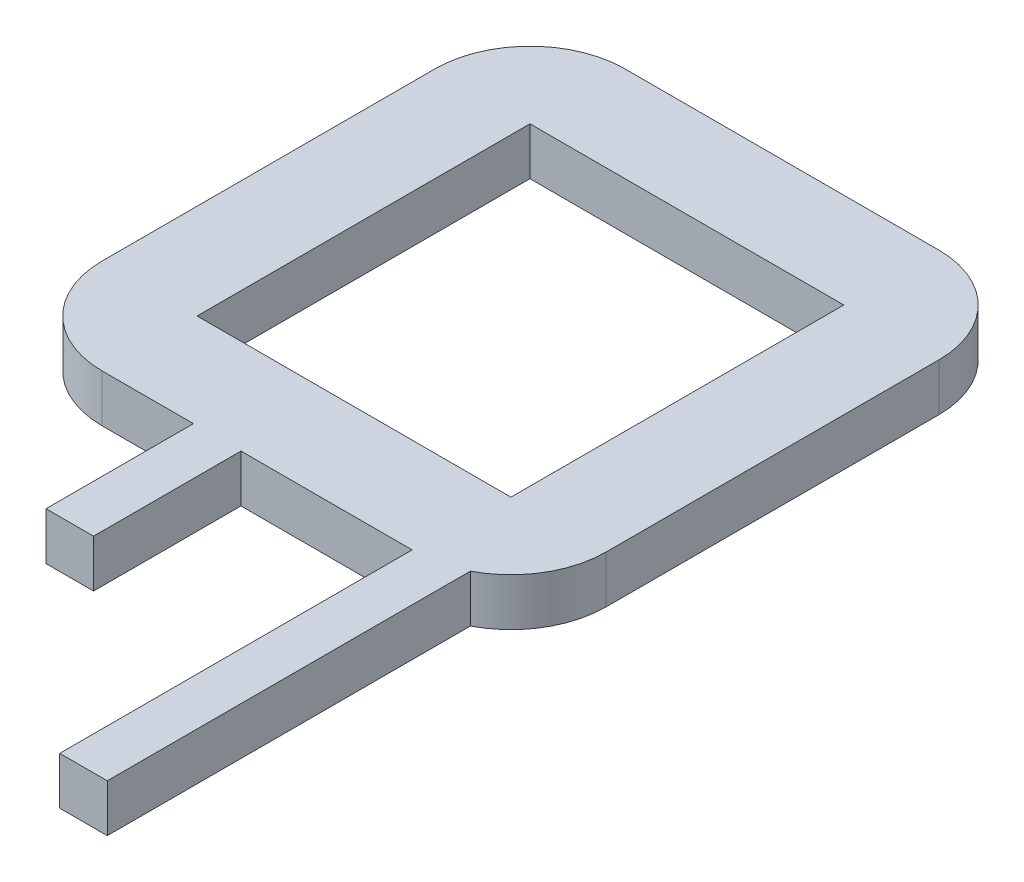
ISO-10303-21;
HEADER;
FILE_DESCRIPTION(('STEP AP214'),'2;1');
FILE_NAME('part.step','',(''),(''),'','','');
FILE_SCHEMA(('AUTOMOTIVE_DESIGN { 1 0 10303 214 1 1 1 1 }'));
ENDSEC;
DATA;
#1=APPLICATION_CONTEXT('core data for automotive mechanical design processes');
#2=APPLICATION_PROTOCOL_DEFINITION('international standard','automotive_design',2000,#1);
#3=PRODUCT_CONTEXT('',#1,'mechanical');
#4=PRODUCT('Part','Part','',(#3));
#5=PRODUCT_RELATED_PRODUCT_CATEGORY('part','',(#4));
#6=PRODUCT_DEFINITION_FORMATION('','',#4);
#7=PRODUCT_DEFINITION_CONTEXT('part definition',#1,'design');
#8=PRODUCT_DEFINITION('design','',#6,#7);
#9=PRODUCT_DEFINITION_SHAPE('','',#8);
#10=(LENGTH_UNIT() NAMED_UNIT(*) SI_UNIT(.MILLI.,.METRE.));
#11=(NAMED_UNIT(*) PLANE_ANGLE_UNIT() SI_UNIT($,.RADIAN.));
#12=(NAMED_UNIT(*) SI_UNIT($,.STERADIAN.) SOLID_ANGLE_UNIT());
#13=UNCERTAINTY_MEASURE_WITH_UNIT(LENGTH_MEASURE(1.E-05),#10,'distance_accuracy_value','');
#14=(GEOMETRIC_REPRESENTATION_CONTEXT(3) GLOBAL_UNCERTAINTY_ASSIGNED_CONTEXT((#13)) GLOBAL_UNIT_ASSIGNED_CONTEXT((#10,
#11,#12)) REPRESENTATION_CONTEXT('',''));
#15=CARTESIAN_POINT('',(0.,0.,0.));
#16=DIRECTION('',(0.,0.,1.));
#17=DIRECTION('',(1.,0.,0.));
#18=AXIS2_PLACEMENT_3D('',#15,#16,#17);
#19=CARTESIAN_POINT('',(0.,5.,17.5));
#20=DIRECTION('',(0.,0.,1.));
#21=DIRECTION('',(1.,0.,0.));
#22=AXIS2_PLACEMENT_3D('',#19,#20,#21);
#23=PLANE('',#22);
#24=DIRECTION('',(-1.,0.,0.));
#25=VECTOR('',#24,1.);
#26=CARTESIAN_POINT('',(0.,0.,17.5));
#27=LINE('',#26,#25);
#28=CARTESIAN_POINT('',(16.5,0.,17.5));
#29=VERTEX_POINT('',#28);
#30=CARTESIAN_POINT('',(-16.5,0.,17.5));
#31=VERTEX_POINT('',#30);
#32=EDGE_CURVE('E238',#29,#31,#27,.T.);
#33=ORIENTED_EDGE('',*,*,#32,.T.);
#34=DIRECTION('',(0.,-1.,0.));
#35=VECTOR('',#34,1.);
#36=CARTESIAN_POINT('',(-16.5,5.,17.5));
#37=LINE('',#36,#35);
#38=CARTESIAN_POINT('',(-16.5,5.,17.5));
#39=VERTEX_POINT('',#38);
#40=EDGE_CURVE('E11',#39,#31,#37,.T.);
#41=ORIENTED_EDGE('',*,*,#40,.F.);
#42=DIRECTION('',(-1.,0.,0.));
#43=VECTOR('',#42,1.);
#44=CARTESIAN_POINT('',(0.,5.,17.5));
#45=LINE('',#44,#43);
#46=CARTESIAN_POINT('',(16.5,5.,17.5));
#47=VERTEX_POINT('',#46);
#48=EDGE_CURVE('E180',#47,#39,#45,.T.);
#49=ORIENTED_EDGE('',*,*,#48,.F.);
#50=DIRECTION('',(0.,-1.,0.));
#51=VECTOR('',#50,1.);
#52=CARTESIAN_POINT('',(16.5,5.,17.5));
#53=LINE('',#52,#51);
#54=EDGE_CURVE('E54',#47,#29,#53,.T.);
#55=ORIENTED_EDGE('',*,*,#54,.T.);
#56=EDGE_LOOP('',(#33,#41,#49,#55));
#57=FACE_BOUND('',#56,.T.);
#58=ADVANCED_FACE('F35',(#57),#23,.F.);
#59=CARTESIAN_POINT('',(-16.5,5.,0.));
#60=DIRECTION('',(-1.,0.,0.));
#61=DIRECTION('',(0.,0.,1.));
#62=AXIS2_PLACEMENT_3D('',#59,#60,#61);
#63=PLANE('',#62);
#64=DIRECTION('',(0.,0.,-1.));
#65=VECTOR('',#64,1.);
#66=CARTESIAN_POINT('',(-16.5,0.,0.));
#67=LINE('',#66,#65);
#68=CARTESIAN_POINT('',(-16.5,0.,-17.5));
#69=VERTEX_POINT('',#68);
#70=EDGE_CURVE('E186',#31,#69,#67,.T.);
#71=ORIENTED_EDGE('',*,*,#70,.T.);
#72=DIRECTION('',(0.,-1.,0.));
#73=VECTOR('',#72,1.);
#74=CARTESIAN_POINT('',(-16.5,5.,-17.5));
#75=LINE('',#74,#73);
#76=CARTESIAN_POINT('',(-16.5,5.,-17.5));
#77=VERTEX_POINT('',#76);
#78=EDGE_CURVE('E45',#77,#69,#75,.T.);
#79=ORIENTED_EDGE('',*,*,#78,.F.);
#80=DIRECTION('',(0.,0.,-1.));
#81=VECTOR('',#80,1.);
#82=CARTESIAN_POINT('',(-16.5,5.,0.));
#83=LINE('',#82,#81);
#84=EDGE_CURVE('E174',#39,#77,#83,.T.);
#85=ORIENTED_EDGE('',*,*,#84,.F.);
#86=ORIENTED_EDGE('',*,*,#40,.T.);
#87=EDGE_LOOP('',(#71,#79,#85,#86));
#88=FACE_BOUND('',#87,.T.);
#89=ADVANCED_FACE('F185',(#88),#63,.F.);
#90=CARTESIAN_POINT('',(0.,5.,-17.5));
#91=DIRECTION('',(0.,0.,1.));
#92=DIRECTION('',(1.,0.,0.));
#93=AXIS2_PLACEMENT_3D('',#90,#91,#92);
#94=PLANE('',#93);
#95=DIRECTION('',(-1.,0.,0.));
#96=VECTOR('',#95,1.);
#97=CARTESIAN_POINT('',(0.,0.,-17.5));
#98=LINE('',#97,#96);
#99=CARTESIAN_POINT('',(16.5,0.,-17.5));
#100=VERTEX_POINT('',#99);
#101=EDGE_CURVE('E241',#100,#69,#98,.T.);
#102=ORIENTED_EDGE('',*,*,#101,.F.);
#103=DIRECTION('',(0.,-1.,0.));
#104=VECTOR('',#103,1.);
#105=CARTESIAN_POINT('',(16.5,5.,-17.5));
#106=LINE('',#105,#104);
#107=CARTESIAN_POINT('',(16.5,5.,-17.5));
#108=VERTEX_POINT('',#107);
#109=EDGE_CURVE('E113',#108,#100,#106,.T.);
#110=ORIENTED_EDGE('',*,*,#109,.F.);
#111=DIRECTION('',(-1.,0.,0.));
#112=VECTOR('',#111,1.);
#113=CARTESIAN_POINT('',(0.,5.,-17.5));
#114=LINE('',#113,#112);
#115=EDGE_CURVE('E179',#108,#77,#114,.T.);
#116=ORIENTED_EDGE('',*,*,#115,.T.);
#117=ORIENTED_EDGE('',*,*,#78,.T.);
#118=EDGE_LOOP('',(#102,#110,#116,#117));
#119=FACE_BOUND('',#118,.T.);
#120=ADVANCED_FACE('F190',(#119),#94,.T.);
#121=CARTESIAN_POINT('',(0.,5.,27.5));
#122=DIRECTION('',(0.,0.,1.));
#123=DIRECTION('',(1.,0.,0.));
#124=AXIS2_PLACEMENT_3D('',#121,#122,#123);
#125=PLANE('',#124);
#126=DIRECTION('',(-1.,0.,0.));
#127=VECTOR('',#126,1.);
#128=CARTESIAN_POINT('',(0.,0.,27.5));
#129=LINE('',#128,#127);
#130=CARTESIAN_POINT('',(16.1075449657305,0.,27.5));
#131=VERTEX_POINT('',#130);
#132=CARTESIAN_POINT('',(-1.89245503426954,0.,27.5));
#133=VERTEX_POINT('',#132);
#134=EDGE_CURVE('E197',#131,#133,#129,.T.);
#135=ORIENTED_EDGE('',*,*,#134,.F.);
#136=DIRECTION('',(0.,-1.,0.));
#137=VECTOR('',#136,1.);
#138=CARTESIAN_POINT('',(16.1075449657305,5.,27.5));
#139=LINE('',#138,#137);
#140=CARTESIAN_POINT('',(16.1075449657305,5.,27.5));
#141=VERTEX_POINT('',#140);
#142=EDGE_CURVE('E39',#141,#131,#139,.T.);
#143=ORIENTED_EDGE('',*,*,#142,.F.);
#144=DIRECTION('',(-1.,0.,0.));
#145=VECTOR('',#144,1.);
#146=CARTESIAN_POINT('',(0.,5.,27.5));
#147=LINE('',#146,#145);
#148=CARTESIAN_POINT('',(-1.89245503426954,5.,27.5));
#149=VERTEX_POINT('',#148);
#150=EDGE_CURVE('E246',#141,#149,#147,.T.);
#151=ORIENTED_EDGE('',*,*,#150,.T.);
#152=DIRECTION('',(0.,-1.,0.));
#153=VECTOR('',#152,1.);
#154=CARTESIAN_POINT('',(-1.89245503426954,5.,27.5));
#155=LINE('',#154,#153);
#156=EDGE_CURVE('E193',#149,#133,#155,.T.);
#157=ORIENTED_EDGE('',*,*,#156,.T.);
#158=EDGE_LOOP('',(#135,#143,#151,#157));
#159=FACE_BOUND('',#158,.T.);
#160=ADVANCED_FACE('F289',(#159),#125,.T.);
#161=CARTESIAN_POINT('',(16.1075449657305,5.,0.));
#162=DIRECTION('',(1.,0.,0.));
#163=DIRECTION('',(0.,0.,-1.));
#164=AXIS2_PLACEMENT_3D('',#161,#162,#163);
#165=PLANE('',#164);
#166=DIRECTION('',(0.,0.,1.));
#167=VECTOR('',#166,1.);
#168=CARTESIAN_POINT('',(16.1075449657305,0.,0.));
#169=LINE('',#168,#167);
#170=CARTESIAN_POINT('',(16.1075449657305,0.,64.5549858242216));
#171=VERTEX_POINT('',#170);
#172=EDGE_CURVE('E200',#131,#171,#169,.T.);
#173=ORIENTED_EDGE('',*,*,#172,.T.);
#174=DIRECTION('',(0.,-1.,0.));
#175=VECTOR('',#174,1.);
#176=CARTESIAN_POINT('',(16.1075449657305,5.,64.5549858242216));
#177=LINE('',#176,#175);
#178=CARTESIAN_POINT('',(16.1075449657305,5.,64.5549858242216));
#179=VERTEX_POINT('',#178);
#180=EDGE_CURVE('E275',#179,#171,#177,.T.);
#181=ORIENTED_EDGE('',*,*,#180,.F.);
#182=DIRECTION('',(0.,0.,1.));
#183=VECTOR('',#182,1.);
#184=CARTESIAN_POINT('',(16.1075449657305,5.,0.));
#185=LINE('',#184,#183);
#186=EDGE_CURVE('E282',#141,#179,#185,.T.);
#187=ORIENTED_EDGE('',*,*,#186,.F.);
#188=ORIENTED_EDGE('',*,*,#142,.T.);
#189=EDGE_LOOP('',(#173,#181,#187,#188));
#190=FACE_BOUND('',#189,.T.);
#191=ADVANCED_FACE('F37',(#190),#165,.F.);
#192=CARTESIAN_POINT('',(0.,5.,64.5549858242216));
#193=DIRECTION('',(0.,0.,1.));
#194=DIRECTION('',(1.,0.,0.));
#195=AXIS2_PLACEMENT_3D('',#192,#193,#194);
#196=PLANE('',#195);
#197=DIRECTION('',(-1.,0.,0.));
#198=VECTOR('',#197,1.);
#199=CARTESIAN_POINT('',(0.,0.,64.5549858242216));
#200=LINE('',#199,#198);
#201=CARTESIAN_POINT('',(21.1075449657305,0.,64.5549858242216));
#202=VERTEX_POINT('',#201);
#203=EDGE_CURVE('E204',#202,#171,#200,.T.);
#204=ORIENTED_EDGE('',*,*,#203,.F.);
#205=DIRECTION('',(0.,-1.,0.));
#206=VECTOR('',#205,1.);
#207=CARTESIAN_POINT('',(21.1075449657305,5.,64.5549858242216));
#208=LINE('',#207,#206);
#209=CARTESIAN_POINT('',(21.1075449657305,5.,64.5549858242216));
#210=VERTEX_POINT('',#209);
#211=EDGE_CURVE('E274',#210,#202,#208,.T.);
#212=ORIENTED_EDGE('',*,*,#211,.F.);
#213=DIRECTION('',(-1.,0.,0.));
#214=VECTOR('',#213,1.);
#215=CARTESIAN_POINT('',(0.,5.,64.5549858242216));
#216=LINE('',#215,#214);
#217=EDGE_CURVE('E357',#210,#179,#216,.T.);
#218=ORIENTED_EDGE('',*,*,#217,.T.);
#219=ORIENTED_EDGE('',*,*,#180,.T.);
#220=EDGE_LOOP('',(#204,#212,#218,#219));
#221=FACE_BOUND('',#220,.T.);
#222=ADVANCED_FACE('F356',(#221),#196,.T.);
#223=CARTESIAN_POINT('',(21.1075449657305,5.,0.));
#224=DIRECTION('',(-1.,0.,0.));
#225=DIRECTION('',(0.,0.,1.));
#226=AXIS2_PLACEMENT_3D('',#223,#224,#225);
#227=PLANE('',#226);
#228=DIRECTION('',(0.,0.,-1.));
#229=VECTOR('',#228,1.);
#230=CARTESIAN_POINT('',(21.1075449657305,0.,0.));
#231=LINE('',#230,#229);
#232=CARTESIAN_POINT('',(21.1075449657305,0.,26.3752762992919));
#233=VERTEX_POINT('',#232);
#234=EDGE_CURVE('E207',#202,#233,#231,.T.);
#235=ORIENTED_EDGE('',*,*,#234,.T.);
#236=DIRECTION('',(0.,-1.,0.));
#237=VECTOR('',#236,1.);
#238=CARTESIAN_POINT('',(21.1075449657305,5.,26.3752762992919));
#239=LINE('',#238,#237);
#240=CARTESIAN_POINT('',(21.1075449657305,5.,26.3752762992919));
#241=VERTEX_POINT('',#240);
#242=EDGE_CURVE('E271',#241,#233,#239,.T.);
#243=ORIENTED_EDGE('',*,*,#242,.F.);
#244=DIRECTION('',(0.,0.,-1.));
#245=VECTOR('',#244,1.);
#246=CARTESIAN_POINT('',(21.1075449657305,5.,0.));
#247=LINE('',#246,#245);
#248=EDGE_CURVE('E354',#210,#241,#247,.T.);
#249=ORIENTED_EDGE('',*,*,#248,.F.);
#250=ORIENTED_EDGE('',*,*,#211,.T.);
#251=EDGE_LOOP('',(#235,#243,#249,#250));
#252=FACE_BOUND('',#251,.T.);
#253=ADVANCED_FACE('F353',(#252),#227,.F.);
#254=CARTESIAN_POINT('',(16.5,5.,17.5));
#255=DIRECTION('',(0.,-1.,0.));
#256=DIRECTION('',(0.,0.,-1.));
#257=AXIS2_PLACEMENT_3D('',#254,#255,#256);
#258=CYLINDRICAL_SURFACE('',#257,10.);
#259=CARTESIAN_POINT('',(16.5,0.,17.5));
#260=DIRECTION('',(0.,1.,0.));
#261=DIRECTION('',(0.,0.,1.));
#262=AXIS2_PLACEMENT_3D('',#259,#260,#261);
#263=CIRCLE('',#262,10.);
#264=CARTESIAN_POINT('',(26.5,0.,17.5));
#265=VERTEX_POINT('',#264);
#266=EDGE_CURVE('E209',#233,#265,#263,.T.);
#267=ORIENTED_EDGE('',*,*,#266,.T.);
#268=DIRECTION('',(0.,-1.,0.));
#269=VECTOR('',#268,1.);
#270=CARTESIAN_POINT('',(26.5,5.,17.5));
#271=LINE('',#270,#269);
#272=CARTESIAN_POINT('',(26.5,5.,17.5));
#273=VERTEX_POINT('',#272);
#274=EDGE_CURVE('E268',#273,#265,#271,.T.);
#275=ORIENTED_EDGE('',*,*,#274,.F.);
#276=CARTESIAN_POINT('',(16.5,5.,17.5));
#277=DIRECTION('',(0.,1.,0.));
#278=DIRECTION('',(0.,0.,1.));
#279=AXIS2_PLACEMENT_3D('',#276,#277,#278);
#280=CIRCLE('',#279,10.);
#281=EDGE_CURVE('E350',#241,#273,#280,.T.);
#282=ORIENTED_EDGE('',*,*,#281,.F.);
#283=ORIENTED_EDGE('',*,*,#242,.T.);
#284=EDGE_LOOP('',(#267,#275,#282,#283));
#285=FACE_BOUND('',#284,.T.);
#286=ADVANCED_FACE('F347',(#285),#258,.T.);
#287=CARTESIAN_POINT('',(26.5,5.,0.));
#288=DIRECTION('',(-1.,0.,0.));
#289=DIRECTION('',(0.,0.,1.));
#290=AXIS2_PLACEMENT_3D('',#287,#288,#289);
#291=PLANE('',#290);
#292=DIRECTION('',(0.,0.,-1.));
#293=VECTOR('',#292,1.);
#294=CARTESIAN_POINT('',(26.5,0.,0.));
#295=LINE('',#294,#293);
#296=CARTESIAN_POINT('',(26.5,0.,-17.5));
#297=VERTEX_POINT('',#296);
#298=EDGE_CURVE('E211',#265,#297,#295,.T.);
#299=ORIENTED_EDGE('',*,*,#298,.T.);
#300=DIRECTION('',(0.,-1.,0.));
#301=VECTOR('',#300,1.);
#302=CARTESIAN_POINT('',(26.5,5.,-17.5));
#303=LINE('',#302,#301);
#304=CARTESIAN_POINT('',(26.5,5.,-17.5));
#305=VERTEX_POINT('',#304);
#306=EDGE_CURVE('E266',#305,#297,#303,.T.);
#307=ORIENTED_EDGE('',*,*,#306,.F.);
#308=DIRECTION('',(0.,0.,-1.));
#309=VECTOR('',#308,1.);
#310=CARTESIAN_POINT('',(26.5,5.,0.));
#311=LINE('',#310,#309);
#312=EDGE_CURVE('E365',#273,#305,#311,.T.);
#313=ORIENTED_EDGE('',*,*,#312,.F.);
#314=ORIENTED_EDGE('',*,*,#274,.T.);
#315=EDGE_LOOP('',(#299,#307,#313,#314));
#316=FACE_BOUND('',#315,.T.);
#317=ADVANCED_FACE('F343',(#316),#291,.F.);
#318=CARTESIAN_POINT('',(16.5,5.,-17.5));
#319=DIRECTION('',(0.,-1.,0.));
#320=DIRECTION('',(0.,0.,-1.));
#321=AXIS2_PLACEMENT_3D('',#318,#319,#320);
#322=CYLINDRICAL_SURFACE('',#321,9.99999999999999);
#323=CARTESIAN_POINT('',(16.5,0.,-17.5));
#324=DIRECTION('',(0.,1.,0.));
#325=DIRECTION('',(0.,0.,1.));
#326=AXIS2_PLACEMENT_3D('',#323,#324,#325);
#327=CIRCLE('',#326,9.99999999999999);
#328=CARTESIAN_POINT('',(16.5,0.,-27.5));
#329=VERTEX_POINT('',#328);
#330=EDGE_CURVE('E214',#329,#297,#327,.F.);
#331=ORIENTED_EDGE('',*,*,#330,.F.);
#332=DIRECTION('',(0.,-1.,0.));
#333=VECTOR('',#332,1.);
#334=CARTESIAN_POINT('',(16.5,5.,-27.5));
#335=LINE('',#334,#333);
#336=CARTESIAN_POINT('',(16.5,5.,-27.5));
#337=VERTEX_POINT('',#336);
#338=EDGE_CURVE('E264',#337,#329,#335,.T.);
#339=ORIENTED_EDGE('',*,*,#338,.F.);
#340=CARTESIAN_POINT('',(16.5,5.,-17.5));
#341=DIRECTION('',(0.,1.,0.));
#342=DIRECTION('',(0.,0.,1.));
#343=AXIS2_PLACEMENT_3D('',#340,#341,#342);
#344=CIRCLE('',#343,9.99999999999999);
#345=EDGE_CURVE('E340',#337,#305,#344,.F.);
#346=ORIENTED_EDGE('',*,*,#345,.T.);
#347=ORIENTED_EDGE('',*,*,#306,.T.);
#348=EDGE_LOOP('',(#331,#339,#346,#347));
#349=FACE_BOUND('',#348,.T.);
#350=ADVANCED_FACE('F335',(#349),#322,.T.);
#351=CARTESIAN_POINT('',(0.,5.,-27.5));
#352=DIRECTION('',(0.,0.,1.));
#353=DIRECTION('',(1.,0.,0.));
#354=AXIS2_PLACEMENT_3D('',#351,#352,#353);
#355=PLANE('',#354);
#356=DIRECTION('',(-1.,0.,0.));
#357=VECTOR('',#356,1.);
#358=CARTESIAN_POINT('',(0.,0.,-27.5));
#359=LINE('',#358,#357);
#360=CARTESIAN_POINT('',(-16.5,0.,-27.5));
#361=VERTEX_POINT('',#360);
#362=EDGE_CURVE('E217',#329,#361,#359,.T.);
#363=ORIENTED_EDGE('',*,*,#362,.T.);
#364=DIRECTION('',(0.,-1.,0.));
#365=VECTOR('',#364,1.);
#366=CARTESIAN_POINT('',(-16.5,5.,-27.5));
#367=LINE('',#366,#365);
#368=CARTESIAN_POINT('',(-16.5,5.,-27.5));
#369=VERTEX_POINT('',#368);
#370=EDGE_CURVE('E262',#369,#361,#367,.T.);
#371=ORIENTED_EDGE('',*,*,#370,.F.);
#372=DIRECTION('',(-1.,0.,0.));
#373=VECTOR('',#372,1.);
#374=CARTESIAN_POINT('',(0.,5.,-27.5));
#375=LINE('',#374,#373);
#376=EDGE_CURVE('E368',#337,#369,#375,.T.);
#377=ORIENTED_EDGE('',*,*,#376,.F.);
#378=ORIENTED_EDGE('',*,*,#338,.T.);
#379=EDGE_LOOP('',(#363,#371,#377,#378));
#380=FACE_BOUND('',#379,.T.);
#381=ADVANCED_FACE('F478',(#380),#355,.F.);
#382=CARTESIAN_POINT('',(-16.5,5.,-17.5));
#383=DIRECTION('',(0.,-1.,0.));
#384=DIRECTION('',(0.,0.,-1.));
#385=AXIS2_PLACEMENT_3D('',#382,#383,#384);
#386=CYLINDRICAL_SURFACE('',#385,9.99999999999997);
#387=CARTESIAN_POINT('',(-16.5,0.,-17.5));
#388=DIRECTION('',(0.,1.,0.));
#389=DIRECTION('',(0.,0.,1.));
#390=AXIS2_PLACEMENT_3D('',#387,#388,#389);
#391=CIRCLE('',#390,9.99999999999997);
#392=CARTESIAN_POINT('',(-26.5,0.,-17.5));
#393=VERTEX_POINT('',#392);
#394=EDGE_CURVE('E220',#393,#361,#391,.F.);
#395=ORIENTED_EDGE('',*,*,#394,.F.);
#396=DIRECTION('',(0.,-1.,0.));
#397=VECTOR('',#396,1.);
#398=CARTESIAN_POINT('',(-26.5,5.,-17.5));
#399=LINE('',#398,#397);
#400=CARTESIAN_POINT('',(-26.5,5.,-17.5));
#401=VERTEX_POINT('',#400);
#402=EDGE_CURVE('E260',#401,#393,#399,.T.);
#403=ORIENTED_EDGE('',*,*,#402,.F.);
#404=CARTESIAN_POINT('',(-16.5,5.,-17.5));
#405=DIRECTION('',(0.,1.,0.));
#406=DIRECTION('',(0.,0.,1.));
#407=AXIS2_PLACEMENT_3D('',#404,#405,#406);
#408=CIRCLE('',#407,9.99999999999997);
#409=EDGE_CURVE('E370',#401,#369,#408,.F.);
#410=ORIENTED_EDGE('',*,*,#409,.T.);
#411=ORIENTED_EDGE('',*,*,#370,.T.);
#412=EDGE_LOOP('',(#395,#403,#410,#411));
#413=FACE_BOUND('',#412,.T.);
#414=ADVANCED_FACE('F328',(#413),#386,.T.);
#415=CARTESIAN_POINT('',(-26.5,5.,0.));
#416=DIRECTION('',(-1.,0.,0.));
#417=DIRECTION('',(0.,0.,1.));
#418=AXIS2_PLACEMENT_3D('',#415,#416,#417);
#419=PLANE('',#418);
#420=DIRECTION('',(0.,0.,-1.));
#421=VECTOR('',#420,1.);
#422=CARTESIAN_POINT('',(-26.5,0.,0.));
#423=LINE('',#422,#421);
#424=CARTESIAN_POINT('',(-26.5,0.,17.5));
#425=VERTEX_POINT('',#424);
#426=EDGE_CURVE('E223',#425,#393,#423,.T.);
#427=ORIENTED_EDGE('',*,*,#426,.F.);
#428=DIRECTION('',(0.,-1.,0.));
#429=VECTOR('',#428,1.);
#430=CARTESIAN_POINT('',(-26.5,5.,17.5));
#431=LINE('',#430,#429);
#432=CARTESIAN_POINT('',(-26.5,5.,17.5));
#433=VERTEX_POINT('',#432);
#434=EDGE_CURVE('E258',#433,#425,#431,.T.);
#435=ORIENTED_EDGE('',*,*,#434,.F.);
#436=DIRECTION('',(0.,0.,-1.));
#437=VECTOR('',#436,1.);
#438=CARTESIAN_POINT('',(-26.5,5.,0.));
#439=LINE('',#438,#437);
#440=EDGE_CURVE('E324',#433,#401,#439,.T.);
#441=ORIENTED_EDGE('',*,*,#440,.T.);
#442=ORIENTED_EDGE('',*,*,#402,.T.);
#443=EDGE_LOOP('',(#427,#435,#441,#442));
#444=FACE_BOUND('',#443,.T.);
#445=ADVANCED_FACE('F319',(#444),#419,.T.);
#446=CARTESIAN_POINT('',(-16.5,5.,17.5));
#447=DIRECTION('',(0.,-1.,0.));
#448=DIRECTION('',(0.,0.,-1.));
#449=AXIS2_PLACEMENT_3D('',#446,#447,#448);
#450=CYLINDRICAL_SURFACE('',#449,9.99999999999999);
#451=CARTESIAN_POINT('',(-16.5,0.,17.5));
#452=DIRECTION('',(0.,1.,0.));
#453=DIRECTION('',(0.,0.,1.));
#454=AXIS2_PLACEMENT_3D('',#451,#452,#453);
#455=CIRCLE('',#454,9.99999999999999);
#456=CARTESIAN_POINT('',(-16.5,0.,27.5));
#457=VERTEX_POINT('',#456);
#458=EDGE_CURVE('E226',#425,#457,#455,.T.);
#459=ORIENTED_EDGE('',*,*,#458,.T.);
#460=DIRECTION('',(0.,-1.,0.));
#461=VECTOR('',#460,1.);
#462=CARTESIAN_POINT('',(-16.5,5.,27.5));
#463=LINE('',#462,#461);
#464=CARTESIAN_POINT('',(-16.5,5.,27.5));
#465=VERTEX_POINT('',#464);
#466=EDGE_CURVE('E256',#465,#457,#463,.T.);
#467=ORIENTED_EDGE('',*,*,#466,.F.);
#468=CARTESIAN_POINT('',(-16.5,5.,17.5));
#469=DIRECTION('',(0.,1.,0.));
#470=DIRECTION('',(0.,0.,1.));
#471=AXIS2_PLACEMENT_3D('',#468,#469,#470);
#472=CIRCLE('',#471,9.99999999999999);
#473=EDGE_CURVE('E373',#433,#465,#472,.T.);
#474=ORIENTED_EDGE('',*,*,#473,.F.);
#475=ORIENTED_EDGE('',*,*,#434,.T.);
#476=EDGE_LOOP('',(#459,#467,#474,#475));
#477=FACE_BOUND('',#476,.T.);
#478=ADVANCED_FACE('F377',(#477),#450,.T.);
#479=CARTESIAN_POINT('',(-6.89245503426954,0.,27.5));
#480=VERTEX_POINT('',#479);
#481=EDGE_CURVE('E201',#480,#457,#129,.T.);
#482=ORIENTED_EDGE('',*,*,#481,.F.);
#483=DIRECTION('',(0.,-1.,0.));
#484=VECTOR('',#483,1.);
#485=CARTESIAN_POINT('',(-6.89245503426954,5.,27.5));
#486=LINE('',#485,#484);
#487=CARTESIAN_POINT('',(-6.89245503426954,5.,27.5));
#488=VERTEX_POINT('',#487);
#489=EDGE_CURVE('E254',#488,#480,#486,.T.);
#490=ORIENTED_EDGE('',*,*,#489,.F.);
#491=EDGE_CURVE('E313',#488,#465,#147,.T.);
#492=ORIENTED_EDGE('',*,*,#491,.T.);
#493=ORIENTED_EDGE('',*,*,#466,.T.);
#494=EDGE_LOOP('',(#482,#490,#492,#493));
#495=FACE_BOUND('',#494,.T.);
#496=ADVANCED_FACE('F312',(#495),#125,.T.);
#497=CARTESIAN_POINT('',(-6.89245503426954,5.,0.));
#498=DIRECTION('',(1.,0.,0.));
#499=DIRECTION('',(0.,0.,-1.));
#500=AXIS2_PLACEMENT_3D('',#497,#498,#499);
#501=PLANE('',#500);
#502=DIRECTION('',(0.,0.,1.));
#503=VECTOR('',#502,1.);
#504=CARTESIAN_POINT('',(-6.89245503426954,0.,0.));
#505=LINE('',#504,#503);
#506=CARTESIAN_POINT('',(-6.89245503426954,0.,43.));
#507=VERTEX_POINT('',#506);
#508=EDGE_CURVE('E229',#480,#507,#505,.T.);
#509=ORIENTED_EDGE('',*,*,#508,.T.);
#510=DIRECTION('',(0.,-1.,0.));
#511=VECTOR('',#510,1.);
#512=CARTESIAN_POINT('',(-6.89245503426954,5.,43.));
#513=LINE('',#512,#511);
#514=CARTESIAN_POINT('',(-6.89245503426954,5.,43.));
#515=VERTEX_POINT('',#514);
#516=EDGE_CURVE('E252',#515,#507,#513,.T.);
#517=ORIENTED_EDGE('',*,*,#516,.F.);
#518=DIRECTION('',(0.,0.,1.));
#519=VECTOR('',#518,1.);
#520=CARTESIAN_POINT('',(-6.89245503426954,5.,0.));
#521=LINE('',#520,#519);
#522=EDGE_CURVE('E308',#488,#515,#521,.T.);
#523=ORIENTED_EDGE('',*,*,#522,.F.);
#524=ORIENTED_EDGE('',*,*,#489,.T.);
#525=EDGE_LOOP('',(#509,#517,#523,#524));
#526=FACE_BOUND('',#525,.T.);
#527=ADVANCED_FACE('F307',(#526),#501,.F.);
#528=CARTESIAN_POINT('',(0.,5.,43.));
#529=DIRECTION('',(0.,0.,1.));
#530=DIRECTION('',(1.,0.,0.));
#531=AXIS2_PLACEMENT_3D('',#528,#529,#530);
#532=PLANE('',#531);
#533=DIRECTION('',(-1.,0.,0.));
#534=VECTOR('',#533,1.);
#535=CARTESIAN_POINT('',(0.,0.,43.));
#536=LINE('',#535,#534);
#537=CARTESIAN_POINT('',(-1.89245503426954,0.,43.));
#538=VERTEX_POINT('',#537);
#539=EDGE_CURVE('E232',#538,#507,#536,.T.);
#540=ORIENTED_EDGE('',*,*,#539,.F.);
#541=DIRECTION('',(0.,-1.,0.));
#542=VECTOR('',#541,1.);
#543=CARTESIAN_POINT('',(-1.89245503426954,5.,43.));
#544=LINE('',#543,#542);
#545=CARTESIAN_POINT('',(-1.89245503426954,5.,43.));
#546=VERTEX_POINT('',#545);
#547=EDGE_CURVE('E250',#546,#538,#544,.T.);
#548=ORIENTED_EDGE('',*,*,#547,.F.);
#549=DIRECTION('',(-1.,0.,0.));
#550=VECTOR('',#549,1.);
#551=CARTESIAN_POINT('',(0.,5.,43.));
#552=LINE('',#551,#550);
#553=EDGE_CURVE('E304',#546,#515,#552,.T.);
#554=ORIENTED_EDGE('',*,*,#553,.T.);
#555=ORIENTED_EDGE('',*,*,#516,.T.);
#556=EDGE_LOOP('',(#540,#548,#554,#555));
#557=FACE_BOUND('',#556,.T.);
#558=ADVANCED_FACE('F300',(#557),#532,.T.);
#559=CARTESIAN_POINT('',(-1.89245503426954,5.,0.));
#560=DIRECTION('',(1.,0.,0.));
#561=DIRECTION('',(0.,0.,-1.));
#562=AXIS2_PLACEMENT_3D('',#559,#560,#561);
#563=PLANE('',#562);
#564=DIRECTION('',(0.,0.,1.));
#565=VECTOR('',#564,1.);
#566=CARTESIAN_POINT('',(-1.89245503426954,0.,0.));
#567=LINE('',#566,#565);
#568=EDGE_CURVE('E235',#133,#538,#567,.T.);
#569=ORIENTED_EDGE('',*,*,#568,.F.);
#570=ORIENTED_EDGE('',*,*,#156,.F.);
#571=DIRECTION('',(0.,0.,1.));
#572=VECTOR('',#571,1.);
#573=CARTESIAN_POINT('',(-1.89245503426954,5.,0.));
#574=LINE('',#573,#572);
#575=EDGE_CURVE('E294',#149,#546,#574,.T.);
#576=ORIENTED_EDGE('',*,*,#575,.T.);
#577=ORIENTED_EDGE('',*,*,#547,.T.);
#578=EDGE_LOOP('',(#569,#570,#576,#577));
#579=FACE_BOUND('',#578,.T.);
#580=ADVANCED_FACE('F293',(#579),#563,.T.);
#581=CARTESIAN_POINT('',(16.5,5.,0.));
#582=DIRECTION('',(-1.,0.,0.));
#583=DIRECTION('',(0.,0.,1.));
#584=AXIS2_PLACEMENT_3D('',#581,#582,#583);
#585=PLANE('',#584);
#586=DIRECTION('',(0.,0.,-1.));
#587=VECTOR('',#586,1.);
#588=CARTESIAN_POINT('',(16.5,0.,0.));
#589=LINE('',#588,#587);
#590=EDGE_CURVE('E243',#29,#100,#589,.T.);
#591=ORIENTED_EDGE('',*,*,#590,.F.);
#592=ORIENTED_EDGE('',*,*,#54,.F.);
#593=DIRECTION('',(0.,0.,-1.));
#594=VECTOR('',#593,1.);
#595=CARTESIAN_POINT('',(16.5,5.,0.));
#596=LINE('',#595,#594);
#597=EDGE_CURVE('E191',#47,#108,#596,.T.);
#598=ORIENTED_EDGE('',*,*,#597,.T.);
#599=ORIENTED_EDGE('',*,*,#109,.T.);
#600=EDGE_LOOP('',(#591,#592,#598,#599));
#601=FACE_BOUND('',#600,.T.);
#602=ADVANCED_FACE('F396',(#601),#585,.T.);
#603=CARTESIAN_POINT('',(0.,5.,0.));
#604=DIRECTION('',(0.,1.,0.));
#605=DIRECTION('',(0.,0.,1.));
#606=AXIS2_PLACEMENT_3D('',#603,#604,#605);
#607=PLANE('',#606);
#608=ORIENTED_EDGE('',*,*,#150,.F.);
#609=ORIENTED_EDGE('',*,*,#186,.T.);
#610=ORIENTED_EDGE('',*,*,#217,.F.);
#611=ORIENTED_EDGE('',*,*,#248,.T.);
#612=ORIENTED_EDGE('',*,*,#281,.T.);
#613=ORIENTED_EDGE('',*,*,#312,.T.);
#614=ORIENTED_EDGE('',*,*,#345,.F.);
#615=ORIENTED_EDGE('',*,*,#376,.T.);
#616=ORIENTED_EDGE('',*,*,#409,.F.);
#617=ORIENTED_EDGE('',*,*,#440,.F.);
#618=ORIENTED_EDGE('',*,*,#473,.T.);
#619=ORIENTED_EDGE('',*,*,#491,.F.);
#620=ORIENTED_EDGE('',*,*,#522,.T.);
#621=ORIENTED_EDGE('',*,*,#553,.F.);
#622=ORIENTED_EDGE('',*,*,#575,.F.);
#623=EDGE_LOOP('',(#608,#609,#610,#611,#612,#613,#614,#615,#616,#617,#618,#619,#620,#621,#622));
#624=FACE_BOUND('',#623,.T.);
#625=ORIENTED_EDGE('',*,*,#48,.T.);
#626=ORIENTED_EDGE('',*,*,#84,.T.);
#627=ORIENTED_EDGE('',*,*,#115,.F.);
#628=ORIENTED_EDGE('',*,*,#597,.F.);
#629=EDGE_LOOP('',(#625,#626,#627,#628));
#630=FACE_BOUND('',#629,.T.);
#631=ADVANCED_FACE('F176',(#624,#630),#607,.T.);
#632=CARTESIAN_POINT('',(0.,0.,0.));
#633=DIRECTION('',(0.,1.,0.));
#634=DIRECTION('',(0.,0.,1.));
#635=AXIS2_PLACEMENT_3D('',#632,#633,#634);
#636=PLANE('',#635);
#637=ORIENTED_EDGE('',*,*,#134,.T.);
#638=ORIENTED_EDGE('',*,*,#568,.T.);
#639=ORIENTED_EDGE('',*,*,#539,.T.);
#640=ORIENTED_EDGE('',*,*,#508,.F.);
#641=ORIENTED_EDGE('',*,*,#481,.T.);
#642=ORIENTED_EDGE('',*,*,#458,.F.);
#643=ORIENTED_EDGE('',*,*,#426,.T.);
#644=ORIENTED_EDGE('',*,*,#394,.T.);
#645=ORIENTED_EDGE('',*,*,#362,.F.);
#646=ORIENTED_EDGE('',*,*,#330,.T.);
#647=ORIENTED_EDGE('',*,*,#298,.F.);
#648=ORIENTED_EDGE('',*,*,#266,.F.);
#649=ORIENTED_EDGE('',*,*,#234,.F.);
#650=ORIENTED_EDGE('',*,*,#203,.T.);
#651=ORIENTED_EDGE('',*,*,#172,.F.);
#652=EDGE_LOOP('',(#637,#638,#639,#640,#641,#642,#643,#644,#645,#646,#647,#648,#649,#650,#651));
#653=FACE_BOUND('',#652,.T.);
#654=ORIENTED_EDGE('',*,*,#32,.F.);
#655=ORIENTED_EDGE('',*,*,#590,.T.);
#656=ORIENTED_EDGE('',*,*,#101,.T.);
#657=ORIENTED_EDGE('',*,*,#70,.F.);
#658=EDGE_LOOP('',(#654,#655,#656,#657));
#659=FACE_BOUND('',#658,.T.);
#660=ADVANCED_FACE('F285',(#653,#659),#636,.F.);
#661=CLOSED_SHELL('',(#58,#89,#120,#160,#191,#222,#253,#286,#317,#350,#381,#414,#445,#478,#496,
#527,#558,#580,#602,#631,#660));
#662=MANIFOLD_SOLID_BREP('B2',#661);
#663=ADVANCED_BREP_SHAPE_REPRESENTATION('',(#18,#662),#14);
#664=SHAPE_DEFINITION_REPRESENTATION(#9,#663);
ENDSEC;
END-ISO-10303-21;
